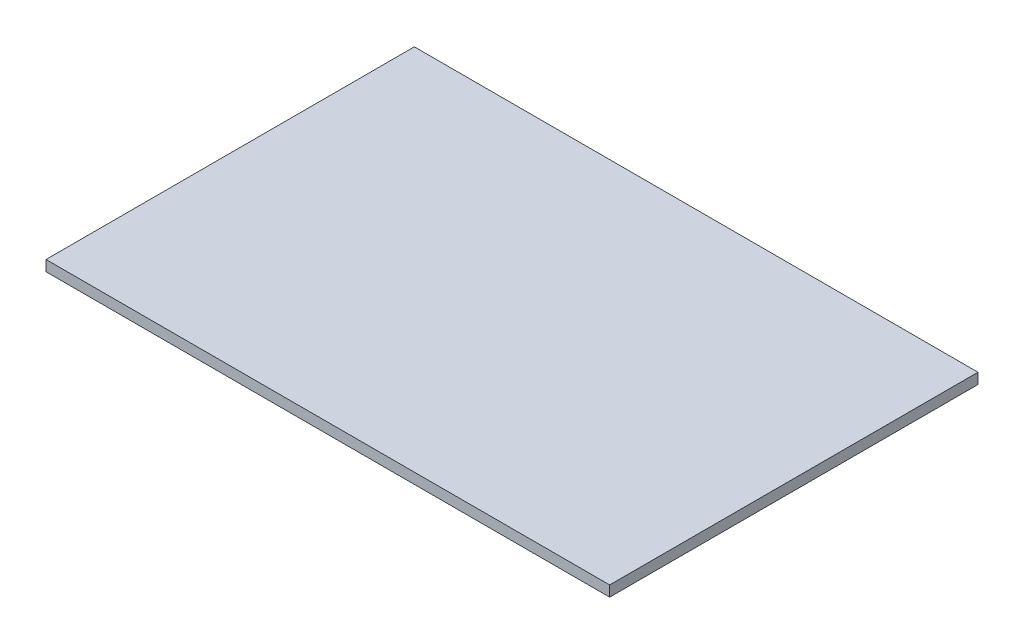
ISO-10303-21;
HEADER;
FILE_DESCRIPTION(('STEP AP214'),'2;1');
FILE_NAME('part.step','',(''),(''),'','','');
FILE_SCHEMA(('AUTOMOTIVE_DESIGN { 1 0 10303 214 1 1 1 1 }'));
ENDSEC;
DATA;
#1=APPLICATION_CONTEXT('core data for automotive mechanical design processes');
#2=APPLICATION_PROTOCOL_DEFINITION('international standard','automotive_design',2000,#1);
#3=PRODUCT_CONTEXT('',#1,'mechanical');
#4=PRODUCT('Part','Part','',(#3));
#5=PRODUCT_RELATED_PRODUCT_CATEGORY('part','',(#4));
#6=PRODUCT_DEFINITION_FORMATION('','',#4);
#7=PRODUCT_DEFINITION_CONTEXT('part definition',#1,'design');
#8=PRODUCT_DEFINITION('design','',#6,#7);
#9=PRODUCT_DEFINITION_SHAPE('','',#8);
#10=(LENGTH_UNIT() NAMED_UNIT(*) SI_UNIT(.MILLI.,.METRE.));
#11=(NAMED_UNIT(*) PLANE_ANGLE_UNIT() SI_UNIT($,.RADIAN.));
#12=(NAMED_UNIT(*) SI_UNIT($,.STERADIAN.) SOLID_ANGLE_UNIT());
#13=UNCERTAINTY_MEASURE_WITH_UNIT(LENGTH_MEASURE(1.E-05),#10,'distance_accuracy_value','');
#14=(GEOMETRIC_REPRESENTATION_CONTEXT(3) GLOBAL_UNCERTAINTY_ASSIGNED_CONTEXT((#13)) GLOBAL_UNIT_ASSIGNED_CONTEXT((#10,
#11,#12)) REPRESENTATION_CONTEXT('',''));
#15=CARTESIAN_POINT('',(0.,0.,0.));
#16=DIRECTION('',(0.,0.,1.));
#17=DIRECTION('',(1.,0.,0.));
#18=AXIS2_PLACEMENT_3D('',#15,#16,#17);
#19=CARTESIAN_POINT('',(41.783,1.5748,27.305));
#20=DIRECTION('',(-1.,0.,0.));
#21=DIRECTION('',(0.,0.,1.));
#22=AXIS2_PLACEMENT_3D('',#19,#20,#21);
#23=PLANE('',#22);
#24=DIRECTION('',(0.,0.,-1.));
#25=VECTOR('',#24,1.);
#26=CARTESIAN_POINT('',(41.783,0.,27.305));
#27=LINE('',#26,#25);
#28=CARTESIAN_POINT('',(41.783,0.,27.305));
#29=VERTEX_POINT('',#28);
#30=CARTESIAN_POINT('',(41.783,0.,-27.305));
#31=VERTEX_POINT('',#30);
#32=EDGE_CURVE('E100',#29,#31,#27,.T.);
#33=ORIENTED_EDGE('',*,*,#32,.T.);
#34=DIRECTION('',(0.,-1.,0.));
#35=VECTOR('',#34,1.);
#36=CARTESIAN_POINT('',(41.783,1.5748,-27.305));
#37=LINE('',#36,#35);
#38=CARTESIAN_POINT('',(41.783,1.5748,-27.305));
#39=VERTEX_POINT('',#38);
#40=EDGE_CURVE('E11',#39,#31,#37,.T.);
#41=ORIENTED_EDGE('',*,*,#40,.F.);
#42=DIRECTION('',(0.,0.,-1.));
#43=VECTOR('',#42,1.);
#44=CARTESIAN_POINT('',(41.783,1.5748,27.305));
#45=LINE('',#44,#43);
#46=CARTESIAN_POINT('',(41.783,1.5748,27.305));
#47=VERTEX_POINT('',#46);
#48=EDGE_CURVE('E88',#47,#39,#45,.T.);
#49=ORIENTED_EDGE('',*,*,#48,.F.);
#50=DIRECTION('',(0.,-1.,0.));
#51=VECTOR('',#50,1.);
#52=CARTESIAN_POINT('',(41.783,1.5748,27.305));
#53=LINE('',#52,#51);
#54=EDGE_CURVE('E96',#47,#29,#53,.T.);
#55=ORIENTED_EDGE('',*,*,#54,.T.);
#56=EDGE_LOOP('',(#33,#41,#49,#55));
#57=FACE_BOUND('',#56,.T.);
#58=ADVANCED_FACE('F37',(#57),#23,.F.);
#59=CARTESIAN_POINT('',(-41.783,1.5748,-27.305));
#60=DIRECTION('',(0.,0.,1.));
#61=DIRECTION('',(1.,0.,0.));
#62=AXIS2_PLACEMENT_3D('',#59,#60,#61);
#63=PLANE('',#62);
#64=DIRECTION('',(-1.,0.,0.));
#65=VECTOR('',#64,1.);
#66=CARTESIAN_POINT('',(-41.783,0.,-27.305));
#67=LINE('',#66,#65);
#68=CARTESIAN_POINT('',(-41.783,0.,-27.305));
#69=VERTEX_POINT('',#68);
#70=EDGE_CURVE('E92',#31,#69,#67,.T.);
#71=ORIENTED_EDGE('',*,*,#70,.T.);
#72=DIRECTION('',(0.,-1.,0.));
#73=VECTOR('',#72,1.);
#74=CARTESIAN_POINT('',(-41.783,1.5748,-27.305));
#75=LINE('',#74,#73);
#76=CARTESIAN_POINT('',(-41.783,1.5748,-27.305));
#77=VERTEX_POINT('',#76);
#78=EDGE_CURVE('E45',#77,#69,#75,.T.);
#79=ORIENTED_EDGE('',*,*,#78,.F.);
#80=DIRECTION('',(-1.,0.,0.));
#81=VECTOR('',#80,1.);
#82=CARTESIAN_POINT('',(-41.783,1.5748,-27.305));
#83=LINE('',#82,#81);
#84=EDGE_CURVE('E83',#39,#77,#83,.T.);
#85=ORIENTED_EDGE('',*,*,#84,.F.);
#86=ORIENTED_EDGE('',*,*,#40,.T.);
#87=EDGE_LOOP('',(#71,#79,#85,#86));
#88=FACE_BOUND('',#87,.T.);
#89=ADVANCED_FACE('F91',(#88),#63,.F.);
#90=CARTESIAN_POINT('',(-41.783,1.5748,27.305));
#91=DIRECTION('',(1.,0.,0.));
#92=DIRECTION('',(0.,0.,-1.));
#93=AXIS2_PLACEMENT_3D('',#90,#91,#92);
#94=PLANE('',#93);
#95=DIRECTION('',(0.,0.,1.));
#96=VECTOR('',#95,1.);
#97=CARTESIAN_POINT('',(-41.783,0.,27.305));
#98=LINE('',#97,#96);
#99=CARTESIAN_POINT('',(-41.783,0.,27.305));
#100=VERTEX_POINT('',#99);
#101=EDGE_CURVE('E70',#69,#100,#98,.T.);
#102=ORIENTED_EDGE('',*,*,#101,.T.);
#103=DIRECTION('',(0.,-1.,0.));
#104=VECTOR('',#103,1.);
#105=CARTESIAN_POINT('',(-41.783,1.5748,27.305));
#106=LINE('',#105,#104);
#107=CARTESIAN_POINT('',(-41.783,1.5748,27.305));
#108=VERTEX_POINT('',#107);
#109=EDGE_CURVE('E93',#108,#100,#106,.T.);
#110=ORIENTED_EDGE('',*,*,#109,.F.);
#111=DIRECTION('',(0.,0.,1.));
#112=VECTOR('',#111,1.);
#113=CARTESIAN_POINT('',(-41.783,1.5748,27.305));
#114=LINE('',#113,#112);
#115=EDGE_CURVE('E86',#77,#108,#114,.T.);
#116=ORIENTED_EDGE('',*,*,#115,.F.);
#117=ORIENTED_EDGE('',*,*,#78,.T.);
#118=EDGE_LOOP('',(#102,#110,#116,#117));
#119=FACE_BOUND('',#118,.T.);
#120=ADVANCED_FACE('F94',(#119),#94,.F.);
#121=CARTESIAN_POINT('',(-41.783,1.5748,27.305));
#122=DIRECTION('',(0.,0.,-1.));
#123=DIRECTION('',(-1.,0.,0.));
#124=AXIS2_PLACEMENT_3D('',#121,#122,#123);
#125=PLANE('',#124);
#126=DIRECTION('',(1.,0.,0.));
#127=VECTOR('',#126,1.);
#128=CARTESIAN_POINT('',(-41.783,0.,27.305));
#129=LINE('',#128,#127);
#130=EDGE_CURVE('E76',#100,#29,#129,.T.);
#131=ORIENTED_EDGE('',*,*,#130,.T.);
#132=ORIENTED_EDGE('',*,*,#54,.F.);
#133=DIRECTION('',(1.,0.,0.));
#134=VECTOR('',#133,1.);
#135=CARTESIAN_POINT('',(-41.783,1.5748,27.305));
#136=LINE('',#135,#134);
#137=EDGE_CURVE('E53',#108,#47,#136,.T.);
#138=ORIENTED_EDGE('',*,*,#137,.F.);
#139=ORIENTED_EDGE('',*,*,#109,.T.);
#140=EDGE_LOOP('',(#131,#132,#138,#139));
#141=FACE_BOUND('',#140,.T.);
#142=ADVANCED_FACE('F107',(#141),#125,.F.);
#143=CARTESIAN_POINT('',(0.,1.5748,0.));
#144=DIRECTION('',(0.,-1.,0.));
#145=DIRECTION('',(0.,0.,-1.));
#146=AXIS2_PLACEMENT_3D('',#143,#144,#145);
#147=PLANE('',#146);
#148=ORIENTED_EDGE('',*,*,#48,.T.);
#149=ORIENTED_EDGE('',*,*,#84,.T.);
#150=ORIENTED_EDGE('',*,*,#115,.T.);
#151=ORIENTED_EDGE('',*,*,#137,.T.);
#152=EDGE_LOOP('',(#148,#149,#150,#151));
#153=FACE_BOUND('',#152,.T.);
#154=ADVANCED_FACE('F84',(#153),#147,.F.);
#155=CARTESIAN_POINT('',(0.,0.,0.));
#156=DIRECTION('',(0.,-1.,0.));
#157=DIRECTION('',(0.,0.,-1.));
#158=AXIS2_PLACEMENT_3D('',#155,#156,#157);
#159=PLANE('',#158);
#160=ORIENTED_EDGE('',*,*,#32,.F.);
#161=ORIENTED_EDGE('',*,*,#130,.F.);
#162=ORIENTED_EDGE('',*,*,#101,.F.);
#163=ORIENTED_EDGE('',*,*,#70,.F.);
#164=EDGE_LOOP('',(#160,#161,#162,#163));
#165=FACE_BOUND('',#164,.T.);
#166=ADVANCED_FACE('F110',(#165),#159,.T.);
#167=CLOSED_SHELL('',(#58,#89,#120,#142,#154,#166));
#168=MANIFOLD_SOLID_BREP('B2',#167);
#169=ADVANCED_BREP_SHAPE_REPRESENTATION('',(#18,#168),#14);
#170=SHAPE_DEFINITION_REPRESENTATION(#9,#169);
ENDSEC;
END-ISO-10303-21;
